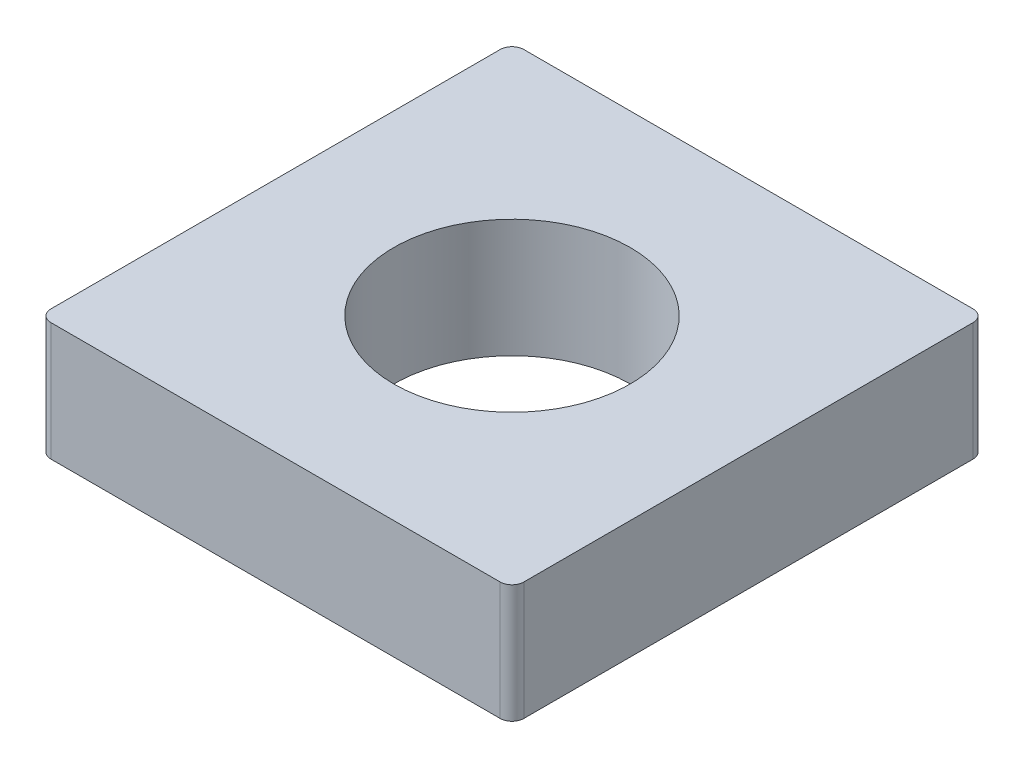
ISO-10303-21;
HEADER;
FILE_DESCRIPTION(('STEP AP214'),'2;1');
FILE_NAME('part.step','',(''),(''),'','','');
FILE_SCHEMA(('AUTOMOTIVE_DESIGN { 1 0 10303 214 1 1 1 1 }'));
ENDSEC;
DATA;
#1=APPLICATION_CONTEXT('core data for automotive mechanical design processes');
#2=APPLICATION_PROTOCOL_DEFINITION('international standard','automotive_design',2000,#1);
#3=PRODUCT_CONTEXT('',#1,'mechanical');
#4=PRODUCT('Part','Part','',(#3));
#5=PRODUCT_RELATED_PRODUCT_CATEGORY('part','',(#4));
#6=PRODUCT_DEFINITION_FORMATION('','',#4);
#7=PRODUCT_DEFINITION_CONTEXT('part definition',#1,'design');
#8=PRODUCT_DEFINITION('design','',#6,#7);
#9=PRODUCT_DEFINITION_SHAPE('','',#8);
#10=(LENGTH_UNIT() NAMED_UNIT(*) SI_UNIT(.MILLI.,.METRE.));
#11=(NAMED_UNIT(*) PLANE_ANGLE_UNIT() SI_UNIT($,.RADIAN.));
#12=(NAMED_UNIT(*) SI_UNIT($,.STERADIAN.) SOLID_ANGLE_UNIT());
#13=UNCERTAINTY_MEASURE_WITH_UNIT(LENGTH_MEASURE(1.E-05),#10,'distance_accuracy_value','');
#14=(GEOMETRIC_REPRESENTATION_CONTEXT(3) GLOBAL_UNCERTAINTY_ASSIGNED_CONTEXT((#13)) GLOBAL_UNIT_ASSIGNED_CONTEXT((#10,
#11,#12)) REPRESENTATION_CONTEXT('',''));
#15=CARTESIAN_POINT('',(0.,0.,0.));
#16=DIRECTION('',(0.,0.,1.));
#17=DIRECTION('',(1.,0.,0.));
#18=AXIS2_PLACEMENT_3D('',#15,#16,#17);
#19=CARTESIAN_POINT('',(0.,1.,0.));
#20=DIRECTION('',(0.,1.,0.));
#21=DIRECTION('',(0.,0.,1.));
#22=AXIS2_PLACEMENT_3D('',#19,#20,#21);
#23=PLANE('',#22);
#24=DIRECTION('',(-1.,0.,0.));
#25=VECTOR('',#24,1.);
#26=CARTESIAN_POINT('',(-4.,1.,-4.));
#27=LINE('',#26,#25);
#28=CARTESIAN_POINT('',(3.8,1.,-4.));
#29=VERTEX_POINT('',#28);
#30=CARTESIAN_POINT('',(-3.8,1.,-4.));
#31=VERTEX_POINT('',#30);
#32=EDGE_CURVE('E170',#29,#31,#27,.T.);
#33=ORIENTED_EDGE('',*,*,#32,.T.);
#34=CARTESIAN_POINT('',(-3.8,1.,-3.8));
#35=DIRECTION('',(0.,1.,0.));
#36=DIRECTION('',(0.,0.,1.));
#37=AXIS2_PLACEMENT_3D('',#34,#35,#36);
#38=CIRCLE('',#37,0.2);
#39=CARTESIAN_POINT('',(-4.,1.,-3.8));
#40=VERTEX_POINT('',#39);
#41=EDGE_CURVE('E148',#31,#40,#38,.T.);
#42=ORIENTED_EDGE('',*,*,#41,.T.);
#43=DIRECTION('',(0.,0.,1.));
#44=VECTOR('',#43,1.);
#45=CARTESIAN_POINT('',(-4.,1.,-4.));
#46=LINE('',#45,#44);
#47=CARTESIAN_POINT('',(-4.,1.,3.8));
#48=VERTEX_POINT('',#47);
#49=EDGE_CURVE('E118',#40,#48,#46,.T.);
#50=ORIENTED_EDGE('',*,*,#49,.T.);
#51=CARTESIAN_POINT('',(-3.8,1.,3.8));
#52=DIRECTION('',(0.,1.,0.));
#53=DIRECTION('',(0.,0.,1.));
#54=AXIS2_PLACEMENT_3D('',#51,#52,#53);
#55=CIRCLE('',#54,0.2);
#56=CARTESIAN_POINT('',(-3.8,1.,4.));
#57=VERTEX_POINT('',#56);
#58=EDGE_CURVE('E54',#48,#57,#55,.T.);
#59=ORIENTED_EDGE('',*,*,#58,.T.);
#60=DIRECTION('',(1.,0.,0.));
#61=VECTOR('',#60,1.);
#62=CARTESIAN_POINT('',(-4.,1.,4.));
#63=LINE('',#62,#61);
#64=CARTESIAN_POINT('',(3.8,1.,4.));
#65=VERTEX_POINT('',#64);
#66=EDGE_CURVE('E134',#57,#65,#63,.T.);
#67=ORIENTED_EDGE('',*,*,#66,.T.);
#68=CARTESIAN_POINT('',(3.8,1.,3.8));
#69=DIRECTION('',(0.,1.,0.));
#70=DIRECTION('',(0.,0.,1.));
#71=AXIS2_PLACEMENT_3D('',#68,#69,#70);
#72=CIRCLE('',#71,0.2);
#73=CARTESIAN_POINT('',(4.,1.,3.8));
#74=VERTEX_POINT('',#73);
#75=EDGE_CURVE('E144',#65,#74,#72,.T.);
#76=ORIENTED_EDGE('',*,*,#75,.T.);
#77=DIRECTION('',(0.,0.,-1.));
#78=VECTOR('',#77,1.);
#79=CARTESIAN_POINT('',(4.,1.,-4.));
#80=LINE('',#79,#78);
#81=CARTESIAN_POINT('',(4.,1.,-3.8));
#82=VERTEX_POINT('',#81);
#83=EDGE_CURVE('E128',#74,#82,#80,.T.);
#84=ORIENTED_EDGE('',*,*,#83,.T.);
#85=CARTESIAN_POINT('',(3.8,1.,-3.8));
#86=DIRECTION('',(0.,1.,0.));
#87=DIRECTION('',(0.,0.,1.));
#88=AXIS2_PLACEMENT_3D('',#85,#86,#87);
#89=CIRCLE('',#88,0.2);
#90=EDGE_CURVE('E146',#82,#29,#89,.T.);
#91=ORIENTED_EDGE('',*,*,#90,.T.);
#92=EDGE_LOOP('',(#33,#42,#50,#59,#67,#76,#84,#91));
#93=FACE_BOUND('',#92,.T.);
#94=CARTESIAN_POINT('',(0.,1.,0.));
#95=DIRECTION('',(0.,1.,0.));
#96=DIRECTION('',(0.,0.,1.));
#97=AXIS2_PLACEMENT_3D('',#94,#95,#96);
#98=CIRCLE('',#97,2.);
#99=CARTESIAN_POINT('',(0.,1.,2.));
#100=VERTEX_POINT('',#99);
#101=EDGE_CURVE('E179',#100,#100,#98,.T.);
#102=ORIENTED_EDGE('',*,*,#101,.F.);
#103=EDGE_LOOP('',(#102));
#104=FACE_BOUND('',#103,.T.);
#105=ADVANCED_FACE('F34',(#93,#104),#23,.T.);
#106=CARTESIAN_POINT('',(0.,-1.,0.));
#107=DIRECTION('',(0.,1.,0.));
#108=DIRECTION('',(0.,0.,1.));
#109=AXIS2_PLACEMENT_3D('',#106,#107,#108);
#110=PLANE('',#109);
#111=DIRECTION('',(0.,0.,1.));
#112=VECTOR('',#111,1.);
#113=CARTESIAN_POINT('',(-4.,-1.,-4.));
#114=LINE('',#113,#112);
#115=CARTESIAN_POINT('',(-4.,-1.,-3.8));
#116=VERTEX_POINT('',#115);
#117=CARTESIAN_POINT('',(-4.,-1.,3.8));
#118=VERTEX_POINT('',#117);
#119=EDGE_CURVE('E116',#116,#118,#114,.T.);
#120=ORIENTED_EDGE('',*,*,#119,.F.);
#121=CARTESIAN_POINT('',(-3.8,-1.,-3.8));
#122=DIRECTION('',(0.,1.,0.));
#123=DIRECTION('',(0.,0.,1.));
#124=AXIS2_PLACEMENT_3D('',#121,#122,#123);
#125=CIRCLE('',#124,0.2);
#126=CARTESIAN_POINT('',(-3.8,-1.,-4.));
#127=VERTEX_POINT('',#126);
#128=EDGE_CURVE('E99',#116,#127,#125,.F.);
#129=ORIENTED_EDGE('',*,*,#128,.T.);
#130=DIRECTION('',(-1.,0.,0.));
#131=VECTOR('',#130,1.);
#132=CARTESIAN_POINT('',(-4.,-1.,-4.));
#133=LINE('',#132,#131);
#134=CARTESIAN_POINT('',(3.8,-1.,-4.));
#135=VERTEX_POINT('',#134);
#136=EDGE_CURVE('E126',#135,#127,#133,.T.);
#137=ORIENTED_EDGE('',*,*,#136,.F.);
#138=CARTESIAN_POINT('',(3.8,-1.,-3.8));
#139=DIRECTION('',(0.,1.,0.));
#140=DIRECTION('',(0.,0.,1.));
#141=AXIS2_PLACEMENT_3D('',#138,#139,#140);
#142=CIRCLE('',#141,0.2);
#143=CARTESIAN_POINT('',(4.,-1.,-3.8));
#144=VERTEX_POINT('',#143);
#145=EDGE_CURVE('E110',#135,#144,#142,.F.);
#146=ORIENTED_EDGE('',*,*,#145,.T.);
#147=DIRECTION('',(0.,0.,-1.));
#148=VECTOR('',#147,1.);
#149=CARTESIAN_POINT('',(4.,-1.,-4.));
#150=LINE('',#149,#148);
#151=CARTESIAN_POINT('',(4.,-1.,3.8));
#152=VERTEX_POINT('',#151);
#153=EDGE_CURVE('E130',#152,#144,#150,.T.);
#154=ORIENTED_EDGE('',*,*,#153,.F.);
#155=CARTESIAN_POINT('',(3.8,-1.,3.8));
#156=DIRECTION('',(0.,1.,0.));
#157=DIRECTION('',(0.,0.,1.));
#158=AXIS2_PLACEMENT_3D('',#155,#156,#157);
#159=CIRCLE('',#158,0.2);
#160=CARTESIAN_POINT('',(3.8,-1.,4.));
#161=VERTEX_POINT('',#160);
#162=EDGE_CURVE('E137',#152,#161,#159,.F.);
#163=ORIENTED_EDGE('',*,*,#162,.T.);
#164=DIRECTION('',(1.,0.,0.));
#165=VECTOR('',#164,1.);
#166=CARTESIAN_POINT('',(-4.,-1.,4.));
#167=LINE('',#166,#165);
#168=CARTESIAN_POINT('',(-3.8,-1.,4.));
#169=VERTEX_POINT('',#168);
#170=EDGE_CURVE('E125',#169,#161,#167,.T.);
#171=ORIENTED_EDGE('',*,*,#170,.F.);
#172=CARTESIAN_POINT('',(-3.8,-1.,3.8));
#173=DIRECTION('',(0.,1.,0.));
#174=DIRECTION('',(0.,0.,1.));
#175=AXIS2_PLACEMENT_3D('',#172,#173,#174);
#176=CIRCLE('',#175,0.2);
#177=EDGE_CURVE('E119',#169,#118,#176,.F.);
#178=ORIENTED_EDGE('',*,*,#177,.T.);
#179=EDGE_LOOP('',(#120,#129,#137,#146,#154,#163,#171,#178));
#180=FACE_BOUND('',#179,.T.);
#181=CARTESIAN_POINT('',(0.,-1.,0.));
#182=DIRECTION('',(0.,1.,0.));
#183=DIRECTION('',(0.,0.,1.));
#184=AXIS2_PLACEMENT_3D('',#181,#182,#183);
#185=CIRCLE('',#184,2.);
#186=CARTESIAN_POINT('',(0.,-1.,2.));
#187=VERTEX_POINT('',#186);
#188=EDGE_CURVE('E175',#187,#187,#185,.T.);
#189=ORIENTED_EDGE('',*,*,#188,.T.);
#190=EDGE_LOOP('',(#189));
#191=FACE_BOUND('',#190,.T.);
#192=ADVANCED_FACE('F122',(#180,#191),#110,.F.);
#193=CARTESIAN_POINT('',(4.,1.,-4.));
#194=DIRECTION('',(-1.,0.,0.));
#195=DIRECTION('',(0.,0.,1.));
#196=AXIS2_PLACEMENT_3D('',#193,#194,#195);
#197=PLANE('',#196);
#198=ORIENTED_EDGE('',*,*,#153,.T.);
#199=DIRECTION('',(0.,-1.,0.));
#200=VECTOR('',#199,1.);
#201=CARTESIAN_POINT('',(4.,1.,-3.8));
#202=LINE('',#201,#200);
#203=EDGE_CURVE('E153',#144,#82,#202,.F.);
#204=ORIENTED_EDGE('',*,*,#203,.T.);
#205=ORIENTED_EDGE('',*,*,#83,.F.);
#206=DIRECTION('',(0.,-1.,0.));
#207=VECTOR('',#206,1.);
#208=CARTESIAN_POINT('',(4.,1.,3.8));
#209=LINE('',#208,#207);
#210=EDGE_CURVE('E150',#74,#152,#209,.T.);
#211=ORIENTED_EDGE('',*,*,#210,.T.);
#212=EDGE_LOOP('',(#198,#204,#205,#211));
#213=FACE_BOUND('',#212,.T.);
#214=ADVANCED_FACE('F166',(#213),#197,.F.);
#215=CARTESIAN_POINT('',(-4.,1.,-4.));
#216=DIRECTION('',(0.,0.,1.));
#217=DIRECTION('',(1.,0.,0.));
#218=AXIS2_PLACEMENT_3D('',#215,#216,#217);
#219=PLANE('',#218);
#220=ORIENTED_EDGE('',*,*,#136,.T.);
#221=DIRECTION('',(0.,-1.,0.));
#222=VECTOR('',#221,1.);
#223=CARTESIAN_POINT('',(-3.8,1.,-4.));
#224=LINE('',#223,#222);
#225=EDGE_CURVE('E104',#127,#31,#224,.F.);
#226=ORIENTED_EDGE('',*,*,#225,.T.);
#227=ORIENTED_EDGE('',*,*,#32,.F.);
#228=DIRECTION('',(0.,-1.,0.));
#229=VECTOR('',#228,1.);
#230=CARTESIAN_POINT('',(3.8,1.,-4.));
#231=LINE('',#230,#229);
#232=EDGE_CURVE('E109',#29,#135,#231,.T.);
#233=ORIENTED_EDGE('',*,*,#232,.T.);
#234=EDGE_LOOP('',(#220,#226,#227,#233));
#235=FACE_BOUND('',#234,.T.);
#236=ADVANCED_FACE('F206',(#235),#219,.F.);
#237=CARTESIAN_POINT('',(-4.,1.,-4.));
#238=DIRECTION('',(1.,0.,0.));
#239=DIRECTION('',(0.,0.,-1.));
#240=AXIS2_PLACEMENT_3D('',#237,#238,#239);
#241=PLANE('',#240);
#242=ORIENTED_EDGE('',*,*,#49,.F.);
#243=DIRECTION('',(0.,-1.,0.));
#244=VECTOR('',#243,1.);
#245=CARTESIAN_POINT('',(-4.,1.,-3.8));
#246=LINE('',#245,#244);
#247=EDGE_CURVE('E103',#40,#116,#246,.T.);
#248=ORIENTED_EDGE('',*,*,#247,.T.);
#249=ORIENTED_EDGE('',*,*,#119,.T.);
#250=DIRECTION('',(0.,-1.,0.));
#251=VECTOR('',#250,1.);
#252=CARTESIAN_POINT('',(-4.,1.,3.8));
#253=LINE('',#252,#251);
#254=EDGE_CURVE('E120',#118,#48,#253,.F.);
#255=ORIENTED_EDGE('',*,*,#254,.T.);
#256=EDGE_LOOP('',(#242,#248,#249,#255));
#257=FACE_BOUND('',#256,.T.);
#258=ADVANCED_FACE('F115',(#257),#241,.F.);
#259=CARTESIAN_POINT('',(-4.,1.,4.));
#260=DIRECTION('',(0.,0.,-1.));
#261=DIRECTION('',(-1.,0.,0.));
#262=AXIS2_PLACEMENT_3D('',#259,#260,#261);
#263=PLANE('',#262);
#264=ORIENTED_EDGE('',*,*,#170,.T.);
#265=DIRECTION('',(0.,-1.,0.));
#266=VECTOR('',#265,1.);
#267=CARTESIAN_POINT('',(3.8,1.,4.));
#268=LINE('',#267,#266);
#269=EDGE_CURVE('E11',#161,#65,#268,.F.);
#270=ORIENTED_EDGE('',*,*,#269,.T.);
#271=ORIENTED_EDGE('',*,*,#66,.F.);
#272=DIRECTION('',(0.,-1.,0.));
#273=VECTOR('',#272,1.);
#274=CARTESIAN_POINT('',(-3.8,1.,4.));
#275=LINE('',#274,#273);
#276=EDGE_CURVE('E42',#57,#169,#275,.T.);
#277=ORIENTED_EDGE('',*,*,#276,.T.);
#278=EDGE_LOOP('',(#264,#270,#271,#277));
#279=FACE_BOUND('',#278,.T.);
#280=ADVANCED_FACE('F156',(#279),#263,.F.);
#281=CARTESIAN_POINT('',(0.,1.,0.));
#282=DIRECTION('',(0.,-1.,0.));
#283=DIRECTION('',(0.,0.,-1.));
#284=AXIS2_PLACEMENT_3D('',#281,#282,#283);
#285=CYLINDRICAL_SURFACE('',#284,2.);
#286=ORIENTED_EDGE('',*,*,#101,.T.);
#287=EDGE_LOOP('',(#286));
#288=FACE_BOUND('',#287,.T.);
#289=ORIENTED_EDGE('',*,*,#188,.F.);
#290=EDGE_LOOP('',(#289));
#291=FACE_BOUND('',#290,.T.);
#292=ADVANCED_FACE('F186',(#288,#291),#285,.F.);
#293=CARTESIAN_POINT('',(-3.8,1.,-3.8));
#294=DIRECTION('',(0.,-1.,0.));
#295=DIRECTION('',(0.,0.,-1.));
#296=AXIS2_PLACEMENT_3D('',#293,#294,#295);
#297=CYLINDRICAL_SURFACE('',#296,0.2);
#298=ORIENTED_EDGE('',*,*,#41,.F.);
#299=ORIENTED_EDGE('',*,*,#225,.F.);
#300=ORIENTED_EDGE('',*,*,#128,.F.);
#301=ORIENTED_EDGE('',*,*,#247,.F.);
#302=EDGE_LOOP('',(#298,#299,#300,#301));
#303=FACE_BOUND('',#302,.T.);
#304=ADVANCED_FACE('F102',(#303),#297,.T.);
#305=CARTESIAN_POINT('',(3.8,1.,-3.8));
#306=DIRECTION('',(0.,-1.,0.));
#307=DIRECTION('',(0.,0.,-1.));
#308=AXIS2_PLACEMENT_3D('',#305,#306,#307);
#309=CYLINDRICAL_SURFACE('',#308,0.2);
#310=ORIENTED_EDGE('',*,*,#90,.F.);
#311=ORIENTED_EDGE('',*,*,#203,.F.);
#312=ORIENTED_EDGE('',*,*,#145,.F.);
#313=ORIENTED_EDGE('',*,*,#232,.F.);
#314=EDGE_LOOP('',(#310,#311,#312,#313));
#315=FACE_BOUND('',#314,.T.);
#316=ADVANCED_FACE('F193',(#315),#309,.T.);
#317=CARTESIAN_POINT('',(3.8,1.,3.8));
#318=DIRECTION('',(0.,-1.,0.));
#319=DIRECTION('',(0.,0.,-1.));
#320=AXIS2_PLACEMENT_3D('',#317,#318,#319);
#321=CYLINDRICAL_SURFACE('',#320,0.2);
#322=ORIENTED_EDGE('',*,*,#75,.F.);
#323=ORIENTED_EDGE('',*,*,#269,.F.);
#324=ORIENTED_EDGE('',*,*,#162,.F.);
#325=ORIENTED_EDGE('',*,*,#210,.F.);
#326=EDGE_LOOP('',(#322,#323,#324,#325));
#327=FACE_BOUND('',#326,.T.);
#328=ADVANCED_FACE('F163',(#327),#321,.T.);
#329=CARTESIAN_POINT('',(-3.8,1.,3.8));
#330=DIRECTION('',(0.,-1.,0.));
#331=DIRECTION('',(0.,0.,-1.));
#332=AXIS2_PLACEMENT_3D('',#329,#330,#331);
#333=CYLINDRICAL_SURFACE('',#332,0.2);
#334=ORIENTED_EDGE('',*,*,#58,.F.);
#335=ORIENTED_EDGE('',*,*,#254,.F.);
#336=ORIENTED_EDGE('',*,*,#177,.F.);
#337=ORIENTED_EDGE('',*,*,#276,.F.);
#338=EDGE_LOOP('',(#334,#335,#336,#337));
#339=FACE_BOUND('',#338,.T.);
#340=ADVANCED_FACE('F36',(#339),#333,.T.);
#341=CLOSED_SHELL('',(#105,#192,#214,#236,#258,#280,#292,#304,#316,#328,#340));
#342=MANIFOLD_SOLID_BREP('B2',#341);
#343=ADVANCED_BREP_SHAPE_REPRESENTATION('',(#18,#342),#14);
#344=SHAPE_DEFINITION_REPRESENTATION(#9,#343);
ENDSEC;
END-ISO-10303-21;
